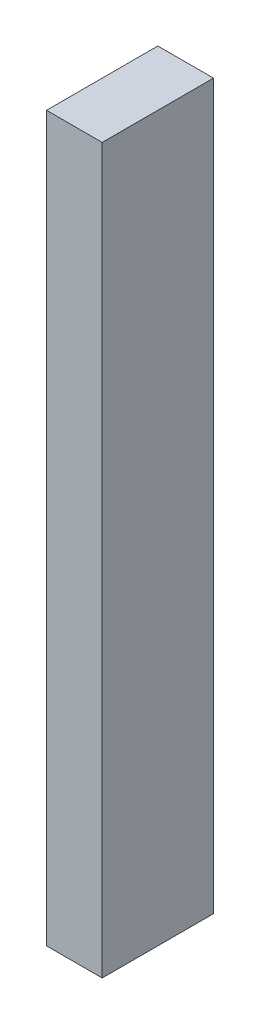
ISO-10303-21;
HEADER;
FILE_DESCRIPTION(('STEP AP214'),'2;1');
FILE_NAME('part.step','',(''),(''),'','','');
FILE_SCHEMA(('AUTOMOTIVE_DESIGN { 1 0 10303 214 1 1 1 1 }'));
ENDSEC;
DATA;
#1=APPLICATION_CONTEXT('core data for automotive mechanical design processes');
#2=APPLICATION_PROTOCOL_DEFINITION('international standard','automotive_design',2000,#1);
#3=PRODUCT_CONTEXT('',#1,'mechanical');
#4=PRODUCT('Part','Part','',(#3));
#5=PRODUCT_RELATED_PRODUCT_CATEGORY('part','',(#4));
#6=PRODUCT_DEFINITION_FORMATION('','',#4);
#7=PRODUCT_DEFINITION_CONTEXT('part definition',#1,'design');
#8=PRODUCT_DEFINITION('design','',#6,#7);
#9=PRODUCT_DEFINITION_SHAPE('','',#8);
#10=(LENGTH_UNIT() NAMED_UNIT(*) SI_UNIT(.MILLI.,.METRE.));
#11=(NAMED_UNIT(*) PLANE_ANGLE_UNIT() SI_UNIT($,.RADIAN.));
#12=(NAMED_UNIT(*) SI_UNIT($,.STERADIAN.) SOLID_ANGLE_UNIT());
#13=UNCERTAINTY_MEASURE_WITH_UNIT(LENGTH_MEASURE(1.E-05),#10,'distance_accuracy_value','');
#14=(GEOMETRIC_REPRESENTATION_CONTEXT(3) GLOBAL_UNCERTAINTY_ASSIGNED_CONTEXT((#13)) GLOBAL_UNIT_ASSIGNED_CONTEXT((#10,
#11,#12)) REPRESENTATION_CONTEXT('',''));
#15=CARTESIAN_POINT('',(0.,0.,0.));
#16=DIRECTION('',(0.,0.,1.));
#17=DIRECTION('',(1.,0.,0.));
#18=AXIS2_PLACEMENT_3D('',#15,#16,#17);
#19=CARTESIAN_POINT('',(-20.,520.,40.));
#20=DIRECTION('',(1.,0.,0.));
#21=DIRECTION('',(0.,0.,-1.));
#22=AXIS2_PLACEMENT_3D('',#19,#20,#21);
#23=PLANE('',#22);
#24=DIRECTION('',(0.,0.,1.));
#25=VECTOR('',#24,1.);
#26=CARTESIAN_POINT('',(-20.,0.,40.));
#27=LINE('',#26,#25);
#28=CARTESIAN_POINT('',(-20.,0.,-40.));
#29=VERTEX_POINT('',#28);
#30=CARTESIAN_POINT('',(-20.,0.,40.));
#31=VERTEX_POINT('',#30);
#32=EDGE_CURVE('E99',#29,#31,#27,.T.);
#33=ORIENTED_EDGE('',*,*,#32,.T.);
#34=DIRECTION('',(0.,-1.,0.));
#35=VECTOR('',#34,1.);
#36=CARTESIAN_POINT('',(-20.,520.,40.));
#37=LINE('',#36,#35);
#38=CARTESIAN_POINT('',(-20.,520.,40.));
#39=VERTEX_POINT('',#38);
#40=EDGE_CURVE('E11',#39,#31,#37,.T.);
#41=ORIENTED_EDGE('',*,*,#40,.F.);
#42=DIRECTION('',(0.,0.,1.));
#43=VECTOR('',#42,1.);
#44=CARTESIAN_POINT('',(-20.,520.,40.));
#45=LINE('',#44,#43);
#46=CARTESIAN_POINT('',(-20.,520.,-40.));
#47=VERTEX_POINT('',#46);
#48=EDGE_CURVE('E87',#47,#39,#45,.T.);
#49=ORIENTED_EDGE('',*,*,#48,.F.);
#50=DIRECTION('',(0.,-1.,0.));
#51=VECTOR('',#50,1.);
#52=CARTESIAN_POINT('',(-20.,520.,-40.));
#53=LINE('',#52,#51);
#54=EDGE_CURVE('E95',#47,#29,#53,.T.);
#55=ORIENTED_EDGE('',*,*,#54,.T.);
#56=EDGE_LOOP('',(#33,#41,#49,#55));
#57=FACE_BOUND('',#56,.T.);
#58=ADVANCED_FACE('F36',(#57),#23,.F.);
#59=CARTESIAN_POINT('',(20.,520.,40.));
#60=DIRECTION('',(0.,0.,-1.));
#61=DIRECTION('',(-1.,0.,0.));
#62=AXIS2_PLACEMENT_3D('',#59,#60,#61);
#63=PLANE('',#62);
#64=DIRECTION('',(1.,0.,0.));
#65=VECTOR('',#64,1.);
#66=CARTESIAN_POINT('',(20.,0.,40.));
#67=LINE('',#66,#65);
#68=CARTESIAN_POINT('',(20.,0.,40.));
#69=VERTEX_POINT('',#68);
#70=EDGE_CURVE('E91',#31,#69,#67,.T.);
#71=ORIENTED_EDGE('',*,*,#70,.T.);
#72=DIRECTION('',(0.,-1.,0.));
#73=VECTOR('',#72,1.);
#74=CARTESIAN_POINT('',(20.,520.,40.));
#75=LINE('',#74,#73);
#76=CARTESIAN_POINT('',(20.,520.,40.));
#77=VERTEX_POINT('',#76);
#78=EDGE_CURVE('E44',#77,#69,#75,.T.);
#79=ORIENTED_EDGE('',*,*,#78,.F.);
#80=DIRECTION('',(1.,0.,0.));
#81=VECTOR('',#80,1.);
#82=CARTESIAN_POINT('',(20.,520.,40.));
#83=LINE('',#82,#81);
#84=EDGE_CURVE('E82',#39,#77,#83,.T.);
#85=ORIENTED_EDGE('',*,*,#84,.F.);
#86=ORIENTED_EDGE('',*,*,#40,.T.);
#87=EDGE_LOOP('',(#71,#79,#85,#86));
#88=FACE_BOUND('',#87,.T.);
#89=ADVANCED_FACE('F90',(#88),#63,.F.);
#90=CARTESIAN_POINT('',(20.,520.,40.));
#91=DIRECTION('',(-1.,0.,0.));
#92=DIRECTION('',(0.,0.,1.));
#93=AXIS2_PLACEMENT_3D('',#90,#91,#92);
#94=PLANE('',#93);
#95=DIRECTION('',(0.,0.,-1.));
#96=VECTOR('',#95,1.);
#97=CARTESIAN_POINT('',(20.,0.,40.));
#98=LINE('',#97,#96);
#99=CARTESIAN_POINT('',(20.,0.,-40.));
#100=VERTEX_POINT('',#99);
#101=EDGE_CURVE('E69',#69,#100,#98,.T.);
#102=ORIENTED_EDGE('',*,*,#101,.T.);
#103=DIRECTION('',(0.,-1.,0.));
#104=VECTOR('',#103,1.);
#105=CARTESIAN_POINT('',(20.,520.,-40.));
#106=LINE('',#105,#104);
#107=CARTESIAN_POINT('',(20.,520.,-40.));
#108=VERTEX_POINT('',#107);
#109=EDGE_CURVE('E92',#108,#100,#106,.T.);
#110=ORIENTED_EDGE('',*,*,#109,.F.);
#111=DIRECTION('',(0.,0.,-1.));
#112=VECTOR('',#111,1.);
#113=CARTESIAN_POINT('',(20.,520.,40.));
#114=LINE('',#113,#112);
#115=EDGE_CURVE('E85',#77,#108,#114,.T.);
#116=ORIENTED_EDGE('',*,*,#115,.F.);
#117=ORIENTED_EDGE('',*,*,#78,.T.);
#118=EDGE_LOOP('',(#102,#110,#116,#117));
#119=FACE_BOUND('',#118,.T.);
#120=ADVANCED_FACE('F93',(#119),#94,.F.);
#121=CARTESIAN_POINT('',(20.,520.,-40.));
#122=DIRECTION('',(0.,0.,1.));
#123=DIRECTION('',(1.,0.,0.));
#124=AXIS2_PLACEMENT_3D('',#121,#122,#123);
#125=PLANE('',#124);
#126=DIRECTION('',(-1.,0.,0.));
#127=VECTOR('',#126,1.);
#128=CARTESIAN_POINT('',(20.,0.,-40.));
#129=LINE('',#128,#127);
#130=EDGE_CURVE('E75',#100,#29,#129,.T.);
#131=ORIENTED_EDGE('',*,*,#130,.T.);
#132=ORIENTED_EDGE('',*,*,#54,.F.);
#133=DIRECTION('',(-1.,0.,0.));
#134=VECTOR('',#133,1.);
#135=CARTESIAN_POINT('',(20.,520.,-40.));
#136=LINE('',#135,#134);
#137=EDGE_CURVE('E52',#108,#47,#136,.T.);
#138=ORIENTED_EDGE('',*,*,#137,.F.);
#139=ORIENTED_EDGE('',*,*,#109,.T.);
#140=EDGE_LOOP('',(#131,#132,#138,#139));
#141=FACE_BOUND('',#140,.T.);
#142=ADVANCED_FACE('F106',(#141),#125,.F.);
#143=CARTESIAN_POINT('',(0.,520.,0.));
#144=DIRECTION('',(0.,1.,0.));
#145=DIRECTION('',(0.,0.,1.));
#146=AXIS2_PLACEMENT_3D('',#143,#144,#145);
#147=PLANE('',#146);
#148=ORIENTED_EDGE('',*,*,#48,.T.);
#149=ORIENTED_EDGE('',*,*,#84,.T.);
#150=ORIENTED_EDGE('',*,*,#115,.T.);
#151=ORIENTED_EDGE('',*,*,#137,.T.);
#152=EDGE_LOOP('',(#148,#149,#150,#151));
#153=FACE_BOUND('',#152,.T.);
#154=ADVANCED_FACE('F83',(#153),#147,.T.);
#155=CARTESIAN_POINT('',(0.,0.,0.));
#156=DIRECTION('',(0.,1.,0.));
#157=DIRECTION('',(0.,0.,1.));
#158=AXIS2_PLACEMENT_3D('',#155,#156,#157);
#159=PLANE('',#158);
#160=ORIENTED_EDGE('',*,*,#32,.F.);
#161=ORIENTED_EDGE('',*,*,#130,.F.);
#162=ORIENTED_EDGE('',*,*,#101,.F.);
#163=ORIENTED_EDGE('',*,*,#70,.F.);
#164=EDGE_LOOP('',(#160,#161,#162,#163));
#165=FACE_BOUND('',#164,.T.);
#166=ADVANCED_FACE('F109',(#165),#159,.F.);
#167=CLOSED_SHELL('',(#58,#89,#120,#142,#154,#166));
#168=MANIFOLD_SOLID_BREP('B2',#167);
#169=ADVANCED_BREP_SHAPE_REPRESENTATION('',(#18,#168),#14);
#170=SHAPE_DEFINITION_REPRESENTATION(#9,#169);
ENDSEC;
END-ISO-10303-21;
